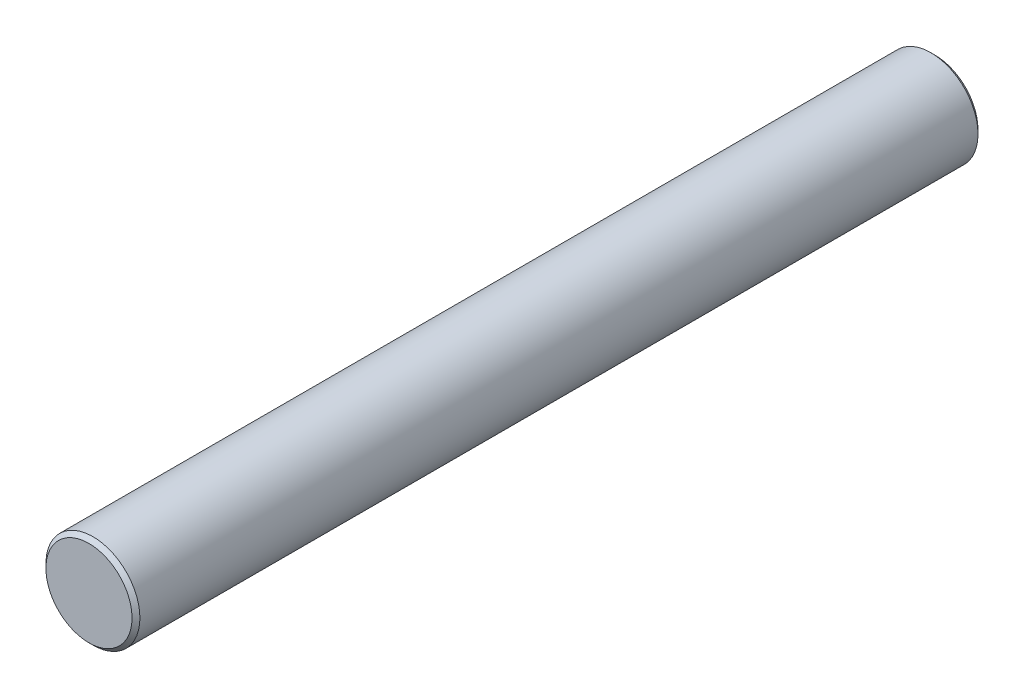
ISO-10303-21;
HEADER;
FILE_DESCRIPTION(('STEP AP214'),'2;1');
FILE_NAME('part.step','',(''),(''),'','','');
FILE_SCHEMA(('AUTOMOTIVE_DESIGN { 1 0 10303 214 1 1 1 1 }'));
ENDSEC;
DATA;
#1=APPLICATION_CONTEXT('core data for automotive mechanical design processes');
#2=APPLICATION_PROTOCOL_DEFINITION('international standard','automotive_design',2000,#1);
#3=PRODUCT_CONTEXT('',#1,'mechanical');
#4=PRODUCT('Part','Part','',(#3));
#5=PRODUCT_RELATED_PRODUCT_CATEGORY('part','',(#4));
#6=PRODUCT_DEFINITION_FORMATION('','',#4);
#7=PRODUCT_DEFINITION_CONTEXT('part definition',#1,'design');
#8=PRODUCT_DEFINITION('design','',#6,#7);
#9=PRODUCT_DEFINITION_SHAPE('','',#8);
#10=(LENGTH_UNIT() NAMED_UNIT(*) SI_UNIT(.MILLI.,.METRE.));
#11=(NAMED_UNIT(*) PLANE_ANGLE_UNIT() SI_UNIT($,.RADIAN.));
#12=(NAMED_UNIT(*) SI_UNIT($,.STERADIAN.) SOLID_ANGLE_UNIT());
#13=UNCERTAINTY_MEASURE_WITH_UNIT(LENGTH_MEASURE(1.E-05),#10,'distance_accuracy_value','');
#14=(GEOMETRIC_REPRESENTATION_CONTEXT(3) GLOBAL_UNCERTAINTY_ASSIGNED_CONTEXT((#13)) GLOBAL_UNIT_ASSIGNED_CONTEXT((#10,
#11,#12)) REPRESENTATION_CONTEXT('',''));
#15=CARTESIAN_POINT('',(0.,0.,0.));
#16=DIRECTION('',(0.,0.,1.));
#17=DIRECTION('',(1.,0.,0.));
#18=AXIS2_PLACEMENT_3D('',#15,#16,#17);
#19=CARTESIAN_POINT('',(0.,0.,85.725));
#20=DIRECTION('',(0.,0.,-1.));
#21=DIRECTION('',(-1.,0.,0.));
#22=AXIS2_PLACEMENT_3D('',#19,#20,#21);
#23=CYLINDRICAL_SURFACE('',#22,4.7625);
#24=CARTESIAN_POINT('',(0.,0.,85.325));
#25=DIRECTION('',(0.,0.,1.));
#26=DIRECTION('',(1.,0.,0.));
#27=AXIS2_PLACEMENT_3D('',#24,#25,#26);
#28=CIRCLE('',#27,4.7625);
#29=CARTESIAN_POINT('',(4.7625,0.,85.325));
#30=VERTEX_POINT('',#29);
#31=EDGE_CURVE('E38',#30,#30,#28,.F.);
#32=ORIENTED_EDGE('',*,*,#31,.T.);
#33=EDGE_LOOP('',(#32));
#34=FACE_BOUND('',#33,.T.);
#35=CARTESIAN_POINT('',(0.,0.,0.399999999999998));
#36=DIRECTION('',(0.,0.,1.));
#37=DIRECTION('',(1.,0.,0.));
#38=AXIS2_PLACEMENT_3D('',#35,#36,#37);
#39=CIRCLE('',#38,4.7625);
#40=CARTESIAN_POINT('',(4.7625,0.,0.399999999999998));
#41=VERTEX_POINT('',#40);
#42=EDGE_CURVE('E42',#41,#41,#39,.T.);
#43=ORIENTED_EDGE('',*,*,#42,.T.);
#44=EDGE_LOOP('',(#43));
#45=FACE_BOUND('',#44,.T.);
#46=ADVANCED_FACE('F31',(#34,#45),#23,.T.);
#47=CARTESIAN_POINT('',(0.,0.,85.725));
#48=DIRECTION('',(0.,0.,1.));
#49=DIRECTION('',(1.,0.,0.));
#50=AXIS2_PLACEMENT_3D('',#47,#48,#49);
#51=PLANE('',#50);
#52=CARTESIAN_POINT('',(0.,0.,85.725));
#53=DIRECTION('',(0.,0.,1.));
#54=DIRECTION('',(1.,0.,0.));
#55=AXIS2_PLACEMENT_3D('',#52,#53,#54);
#56=CIRCLE('',#55,4.36250000000002);
#57=CARTESIAN_POINT('',(4.36250000000002,0.,85.725));
#58=VERTEX_POINT('',#57);
#59=EDGE_CURVE('E46',#58,#58,#56,.T.);
#60=ORIENTED_EDGE('',*,*,#59,.T.);
#61=EDGE_LOOP('',(#60));
#62=FACE_BOUND('',#61,.T.);
#63=ADVANCED_FACE('F52',(#62),#51,.T.);
#64=CARTESIAN_POINT('',(0.,0.,0.));
#65=DIRECTION('',(0.,0.,1.));
#66=DIRECTION('',(1.,0.,0.));
#67=AXIS2_PLACEMENT_3D('',#64,#65,#66);
#68=PLANE('',#67);
#69=CARTESIAN_POINT('',(0.,0.,0.));
#70=DIRECTION('',(0.,0.,1.));
#71=DIRECTION('',(1.,0.,0.));
#72=AXIS2_PLACEMENT_3D('',#69,#70,#71);
#73=CIRCLE('',#72,4.36250000000001);
#74=CARTESIAN_POINT('',(4.36250000000001,0.,0.));
#75=VERTEX_POINT('',#74);
#76=EDGE_CURVE('E10',#75,#75,#73,.F.);
#77=ORIENTED_EDGE('',*,*,#76,.T.);
#78=EDGE_LOOP('',(#77));
#79=FACE_BOUND('',#78,.T.);
#80=ADVANCED_FACE('F56',(#79),#68,.F.);
#81=CARTESIAN_POINT('',(0.,0.,85.725));
#82=DIRECTION('',(0.,0.,-1.));
#83=DIRECTION('',(-1.,0.,0.));
#84=AXIS2_PLACEMENT_3D('',#81,#82,#83);
#85=CONICAL_SURFACE('',#84,4.36250000000002,0.785398163397428);
#86=ORIENTED_EDGE('',*,*,#31,.F.);
#87=EDGE_LOOP('',(#86));
#88=FACE_BOUND('',#87,.T.);
#89=ORIENTED_EDGE('',*,*,#59,.F.);
#90=EDGE_LOOP('',(#89));
#91=FACE_BOUND('',#90,.T.);
#92=ADVANCED_FACE('F54',(#88,#91),#85,.T.);
#93=CARTESIAN_POINT('',(0.,0.,0.399999999999998));
#94=DIRECTION('',(0.,0.,1.));
#95=DIRECTION('',(1.,0.,0.));
#96=AXIS2_PLACEMENT_3D('',#93,#94,#95);
#97=CONICAL_SURFACE('',#96,4.7625,0.785398163397436);
#98=ORIENTED_EDGE('',*,*,#76,.F.);
#99=EDGE_LOOP('',(#98));
#100=FACE_BOUND('',#99,.T.);
#101=ORIENTED_EDGE('',*,*,#42,.F.);
#102=EDGE_LOOP('',(#101));
#103=FACE_BOUND('',#102,.T.);
#104=ADVANCED_FACE('F33',(#100,#103),#97,.T.);
#105=CLOSED_SHELL('',(#46,#63,#80,#92,#104));
#106=MANIFOLD_SOLID_BREP('B2',#105);
#107=ADVANCED_BREP_SHAPE_REPRESENTATION('',(#18,#106),#14);
#108=SHAPE_DEFINITION_REPRESENTATION(#9,#107);
ENDSEC;
END-ISO-10303-21;
